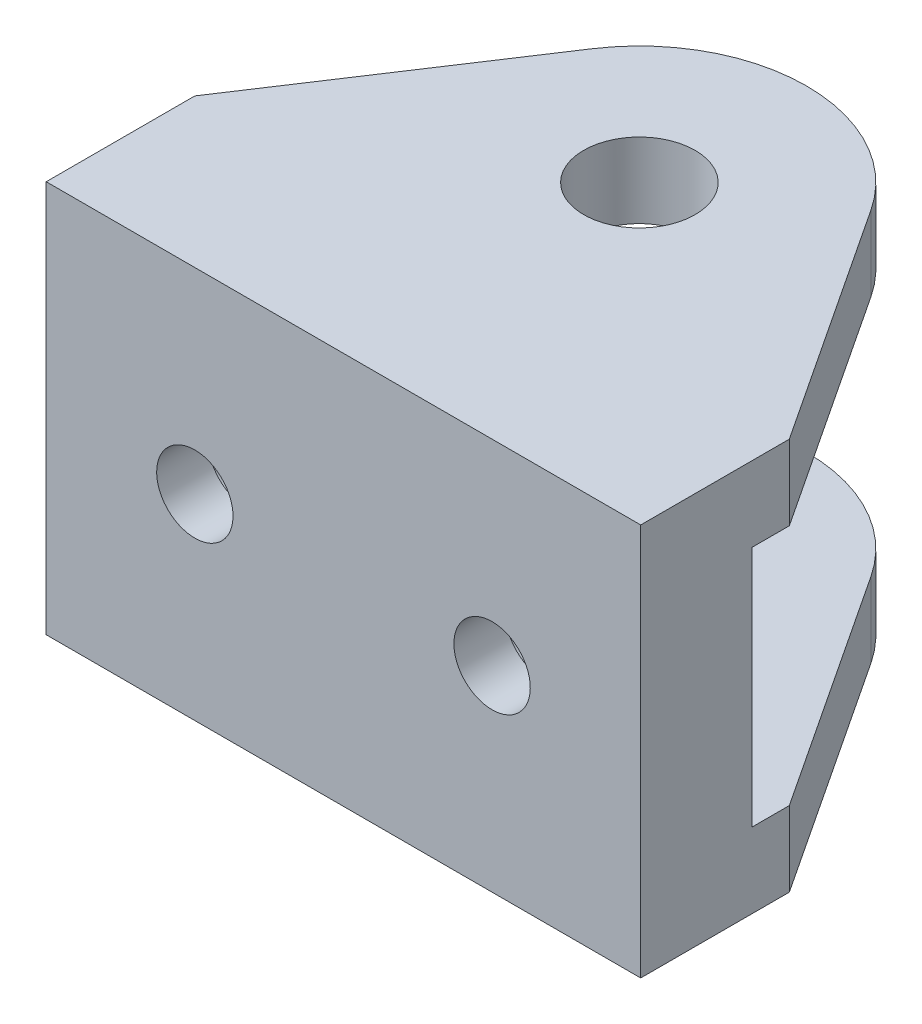
ISO-10303-21;
HEADER;
FILE_DESCRIPTION(('STEP AP214'),'2;1');
FILE_NAME('part.step','',(''),(''),'','','');
FILE_SCHEMA(('AUTOMOTIVE_DESIGN { 1 0 10303 214 1 1 1 1 }'));
ENDSEC;
DATA;
#1=APPLICATION_CONTEXT('core data for automotive mechanical design processes');
#2=APPLICATION_PROTOCOL_DEFINITION('international standard','automotive_design',2000,#1);
#3=PRODUCT_CONTEXT('',#1,'mechanical');
#4=PRODUCT('Part','Part','',(#3));
#5=PRODUCT_RELATED_PRODUCT_CATEGORY('part','',(#4));
#6=PRODUCT_DEFINITION_FORMATION('','',#4);
#7=PRODUCT_DEFINITION_CONTEXT('part definition',#1,'design');
#8=PRODUCT_DEFINITION('design','',#6,#7);
#9=PRODUCT_DEFINITION_SHAPE('','',#8);
#10=(LENGTH_UNIT() NAMED_UNIT(*) SI_UNIT(.MILLI.,.METRE.));
#11=(NAMED_UNIT(*) PLANE_ANGLE_UNIT() SI_UNIT($,.RADIAN.));
#12=(NAMED_UNIT(*) SI_UNIT($,.STERADIAN.) SOLID_ANGLE_UNIT());
#13=UNCERTAINTY_MEASURE_WITH_UNIT(LENGTH_MEASURE(1.E-05),#10,'distance_accuracy_value','');
#14=(GEOMETRIC_REPRESENTATION_CONTEXT(3) GLOBAL_UNCERTAINTY_ASSIGNED_CONTEXT((#13)) GLOBAL_UNIT_ASSIGNED_CONTEXT((#10,
#11,#12)) REPRESENTATION_CONTEXT('',''));
#15=CARTESIAN_POINT('',(0.,0.,0.));
#16=DIRECTION('',(0.,0.,1.));
#17=DIRECTION('',(1.,0.,0.));
#18=AXIS2_PLACEMENT_3D('',#15,#16,#17);
#19=CARTESIAN_POINT('',(12.7,16.764,9.23170329245909));
#20=DIRECTION('',(0.,0.,-1.));
#21=DIRECTION('',(0.,1.,0.));
#22=AXIS2_PLACEMENT_3D('',#19,#20,#21);
#23=CYLINDRICAL_SURFACE('',#22,3.2639);
#24=CARTESIAN_POINT('',(12.7,16.764,0.));
#25=DIRECTION('',(0.,0.,-1.));
#26=DIRECTION('',(-1.,0.,0.));
#27=AXIS2_PLACEMENT_3D('',#24,#25,#26);
#28=CIRCLE('',#27,3.2639);
#29=CARTESIAN_POINT('',(12.7,20.0279,0.));
#30=VERTEX_POINT('',#29);
#31=EDGE_CURVE('E309',#30,#30,#28,.F.);
#32=CARTESIAN_POINT('',(12.7,16.764,-4.4196));
#33=DIRECTION('',(0.,0.,-1.));
#34=DIRECTION('',(0.,1.,0.));
#35=AXIS2_PLACEMENT_3D('',#32,#33,#34);
#36=CIRCLE('',#35,3.2639);
#37=CARTESIAN_POINT('',(12.7,20.0279,-4.4196));
#38=VERTEX_POINT('',#37);
#39=EDGE_CURVE('E51',#38,#38,#36,.F.);
#40=CARTESIAN_POINT('',(12.7,20.0279,0.));
#41=CARTESIAN_POINT('',(12.7,20.0279,-0.0460375000000002));
#42=CARTESIAN_POINT('',(12.7,20.0279,-0.0920750000000005));
#43=CARTESIAN_POINT('',(12.7,20.0279,-0.18415));
#44=CARTESIAN_POINT('',(12.7,20.0279,-0.2301875));
#45=CARTESIAN_POINT('',(12.7,20.0279,-0.3222625));
#46=CARTESIAN_POINT('',(12.7,20.0279,-0.3683));
#47=CARTESIAN_POINT('',(12.7,20.0279,-0.460375));
#48=CARTESIAN_POINT('',(12.7,20.0279,-0.5064125));
#49=CARTESIAN_POINT('',(12.7,20.0279,-0.5984875));
#50=CARTESIAN_POINT('',(12.7,20.0279,-0.644525));
#51=CARTESIAN_POINT('',(12.7,20.0279,-0.7366));
#52=CARTESIAN_POINT('',(12.7,20.0279,-0.7826375));
#53=CARTESIAN_POINT('',(12.7,20.0279,-0.874712499999999));
#54=CARTESIAN_POINT('',(12.7,20.0279,-0.92075));
#55=CARTESIAN_POINT('',(12.7,20.0279,-1.012825));
#56=CARTESIAN_POINT('',(12.7,20.0279,-1.0588625));
#57=CARTESIAN_POINT('',(12.7,20.0279,-1.1509375));
#58=CARTESIAN_POINT('',(12.7,20.0279,-1.196975));
#59=CARTESIAN_POINT('',(12.7,20.0279,-1.28905));
#60=CARTESIAN_POINT('',(12.7,20.0279,-1.3350875));
#61=CARTESIAN_POINT('',(12.7,20.0279,-1.4271625));
#62=CARTESIAN_POINT('',(12.7,20.0279,-1.4732));
#63=CARTESIAN_POINT('',(12.7,20.0279,-1.565275));
#64=CARTESIAN_POINT('',(12.7,20.0279,-1.6113125));
#65=CARTESIAN_POINT('',(12.7,20.0279,-1.7033875));
#66=CARTESIAN_POINT('',(12.7,20.0279,-1.749425));
#67=CARTESIAN_POINT('',(12.7,20.0279,-1.8415));
#68=CARTESIAN_POINT('',(12.7,20.0279,-1.8875375));
#69=CARTESIAN_POINT('',(12.7,20.0279,-1.9796125));
#70=CARTESIAN_POINT('',(12.7,20.0279,-2.02565));
#71=CARTESIAN_POINT('',(12.7,20.0279,-2.117725));
#72=CARTESIAN_POINT('',(12.7,20.0279,-2.1637625));
#73=CARTESIAN_POINT('',(12.7,20.0279,-2.2558375));
#74=CARTESIAN_POINT('',(12.7,20.0279,-2.301875));
#75=CARTESIAN_POINT('',(12.7,20.0279,-2.39395));
#76=CARTESIAN_POINT('',(12.7,20.0279,-2.4399875));
#77=CARTESIAN_POINT('',(12.7,20.0279,-2.5320625));
#78=CARTESIAN_POINT('',(12.7,20.0279,-2.5781));
#79=CARTESIAN_POINT('',(12.7,20.0279,-2.670175));
#80=CARTESIAN_POINT('',(12.7,20.0279,-2.7162125));
#81=CARTESIAN_POINT('',(12.7,20.0279,-2.8082875));
#82=CARTESIAN_POINT('',(12.7,20.0279,-2.854325));
#83=CARTESIAN_POINT('',(12.7,20.0279,-2.9464));
#84=CARTESIAN_POINT('',(12.7,20.0279,-2.9924375));
#85=CARTESIAN_POINT('',(12.7,20.0279,-3.0845125));
#86=CARTESIAN_POINT('',(12.7,20.0279,-3.13055));
#87=CARTESIAN_POINT('',(12.7,20.0279,-3.222625));
#88=CARTESIAN_POINT('',(12.7,20.0279,-3.2686625));
#89=CARTESIAN_POINT('',(12.7,20.0279,-3.3607375));
#90=CARTESIAN_POINT('',(12.7,20.0279,-3.406775));
#91=CARTESIAN_POINT('',(12.7,20.0279,-3.49885));
#92=CARTESIAN_POINT('',(12.7,20.0279,-3.5448875));
#93=CARTESIAN_POINT('',(12.7,20.0279,-3.6369625));
#94=CARTESIAN_POINT('',(12.7,20.0279,-3.683));
#95=CARTESIAN_POINT('',(12.7,20.0279,-3.775075));
#96=CARTESIAN_POINT('',(12.7,20.0279,-3.8211125));
#97=CARTESIAN_POINT('',(12.7,20.0279,-3.9131875));
#98=CARTESIAN_POINT('',(12.7,20.0279,-3.959225));
#99=CARTESIAN_POINT('',(12.7,20.0279,-4.0513));
#100=CARTESIAN_POINT('',(12.7,20.0279,-4.0973375));
#101=CARTESIAN_POINT('',(12.7,20.0279,-4.1894125));
#102=CARTESIAN_POINT('',(12.7,20.0279,-4.23545));
#103=CARTESIAN_POINT('',(12.7,20.0279,-4.327525));
#104=CARTESIAN_POINT('',(12.7,20.0279,-4.3735625));
#105=CARTESIAN_POINT('',(12.7,20.0279,-4.4196));
#106=B_SPLINE_CURVE_WITH_KNOTS('',3,(#40,#41,#42,#43,#44,#45,#46,#47,#48,#49,#50,#51,#52,#53,
#54,#55,#56,#57,#58,#59,#60,#61,#62,#63,#64,#65,#66,#67,#68,#69,#70,#71,#72,#73,#74,#75,#76,#77,
#78,#79,#80,#81,#82,#83,#84,#85,#86,#87,#88,#89,#90,#91,#92,#93,#94,#95,#96,#97,#98,#99,#100,
#101,#102,#103,#104,#105),.UNSPECIFIED.,.F.,.F.,(4,2,2,2,2,2,2,2,2,2,2,2,2,2,2,2,2,2,2,2,2,2,2,
2,2,2,2,2,2,2,2,2,4),(0.,0.138112500000001,0.276225,0.4143375,0.552449999999999,0.6905625,
0.828674999999999,0.9667875,1.1049,1.2430125,1.381125,1.5192375,1.65735,1.7954625,1.933575,
2.0716875,2.2098,2.3479125,2.486025,2.6241375,2.76225,2.9003625,3.038475,3.1765875,3.3147,
3.4528125,3.590925,3.7290375,3.86715,4.0052625,4.143375,4.2814875,4.4196),.UNSPECIFIED.);
#107=EDGE_CURVE('BSEAM47',#30,#38,#106,.T.);
#108=ORIENTED_EDGE('',*,*,#31,.T.);
#109=ORIENTED_EDGE('',*,*,#39,.F.);
#110=ORIENTED_EDGE('',*,*,#107,.T.);
#111=ORIENTED_EDGE('',*,*,#107,.F.);
#112=EDGE_LOOP('',(#108,#110,#109,#111));
#113=FACE_BOUND('',#112,.T.);
#114=ADVANCED_FACE('F47',(#113),#23,.F.);
#115=CARTESIAN_POINT('',(38.1,16.764,9.23170329245909));
#116=DIRECTION('',(0.,0.,-1.));
#117=DIRECTION('',(0.,1.,0.));
#118=AXIS2_PLACEMENT_3D('',#115,#116,#117);
#119=CYLINDRICAL_SURFACE('',#118,3.2639);
#120=CARTESIAN_POINT('',(38.1,16.764,0.));
#121=DIRECTION('',(0.,0.,-1.));
#122=DIRECTION('',(-1.,0.,0.));
#123=AXIS2_PLACEMENT_3D('',#120,#121,#122);
#124=CIRCLE('',#123,3.2639);
#125=CARTESIAN_POINT('',(38.1,20.0279,0.));
#126=VERTEX_POINT('',#125);
#127=EDGE_CURVE('E190',#126,#126,#124,.F.);
#128=CARTESIAN_POINT('',(38.1,16.764,-4.4196));
#129=DIRECTION('',(0.,0.,-1.));
#130=DIRECTION('',(0.,1.,0.));
#131=AXIS2_PLACEMENT_3D('',#128,#129,#130);
#132=CIRCLE('',#131,3.2639);
#133=CARTESIAN_POINT('',(38.1,20.0279,-4.4196));
#134=VERTEX_POINT('',#133);
#135=EDGE_CURVE('E220',#134,#134,#132,.F.);
#136=CARTESIAN_POINT('',(38.1,20.0279,0.));
#137=CARTESIAN_POINT('',(38.1,20.0279,-0.0460375000000002));
#138=CARTESIAN_POINT('',(38.1,20.0279,-0.0920750000000005));
#139=CARTESIAN_POINT('',(38.1,20.0279,-0.18415));
#140=CARTESIAN_POINT('',(38.1,20.0279,-0.2301875));
#141=CARTESIAN_POINT('',(38.1,20.0279,-0.3222625));
#142=CARTESIAN_POINT('',(38.1,20.0279,-0.3683));
#143=CARTESIAN_POINT('',(38.1,20.0279,-0.460375));
#144=CARTESIAN_POINT('',(38.1,20.0279,-0.5064125));
#145=CARTESIAN_POINT('',(38.1,20.0279,-0.5984875));
#146=CARTESIAN_POINT('',(38.1,20.0279,-0.644525));
#147=CARTESIAN_POINT('',(38.1,20.0279,-0.7366));
#148=CARTESIAN_POINT('',(38.1,20.0279,-0.7826375));
#149=CARTESIAN_POINT('',(38.1,20.0279,-0.874712499999999));
#150=CARTESIAN_POINT('',(38.1,20.0279,-0.92075));
#151=CARTESIAN_POINT('',(38.1,20.0279,-1.012825));
#152=CARTESIAN_POINT('',(38.1,20.0279,-1.0588625));
#153=CARTESIAN_POINT('',(38.1,20.0279,-1.1509375));
#154=CARTESIAN_POINT('',(38.1,20.0279,-1.196975));
#155=CARTESIAN_POINT('',(38.1,20.0279,-1.28905));
#156=CARTESIAN_POINT('',(38.1,20.0279,-1.3350875));
#157=CARTESIAN_POINT('',(38.1,20.0279,-1.4271625));
#158=CARTESIAN_POINT('',(38.1,20.0279,-1.4732));
#159=CARTESIAN_POINT('',(38.1,20.0279,-1.565275));
#160=CARTESIAN_POINT('',(38.1,20.0279,-1.6113125));
#161=CARTESIAN_POINT('',(38.1,20.0279,-1.7033875));
#162=CARTESIAN_POINT('',(38.1,20.0279,-1.749425));
#163=CARTESIAN_POINT('',(38.1,20.0279,-1.8415));
#164=CARTESIAN_POINT('',(38.1,20.0279,-1.8875375));
#165=CARTESIAN_POINT('',(38.1,20.0279,-1.9796125));
#166=CARTESIAN_POINT('',(38.1,20.0279,-2.02565));
#167=CARTESIAN_POINT('',(38.1,20.0279,-2.117725));
#168=CARTESIAN_POINT('',(38.1,20.0279,-2.1637625));
#169=CARTESIAN_POINT('',(38.1,20.0279,-2.2558375));
#170=CARTESIAN_POINT('',(38.1,20.0279,-2.301875));
#171=CARTESIAN_POINT('',(38.1,20.0279,-2.39395));
#172=CARTESIAN_POINT('',(38.1,20.0279,-2.4399875));
#173=CARTESIAN_POINT('',(38.1,20.0279,-2.5320625));
#174=CARTESIAN_POINT('',(38.1,20.0279,-2.5781));
#175=CARTESIAN_POINT('',(38.1,20.0279,-2.670175));
#176=CARTESIAN_POINT('',(38.1,20.0279,-2.7162125));
#177=CARTESIAN_POINT('',(38.1,20.0279,-2.8082875));
#178=CARTESIAN_POINT('',(38.1,20.0279,-2.854325));
#179=CARTESIAN_POINT('',(38.1,20.0279,-2.9464));
#180=CARTESIAN_POINT('',(38.1,20.0279,-2.9924375));
#181=CARTESIAN_POINT('',(38.1,20.0279,-3.0845125));
#182=CARTESIAN_POINT('',(38.1,20.0279,-3.13055));
#183=CARTESIAN_POINT('',(38.1,20.0279,-3.222625));
#184=CARTESIAN_POINT('',(38.1,20.0279,-3.2686625));
#185=CARTESIAN_POINT('',(38.1,20.0279,-3.3607375));
#186=CARTESIAN_POINT('',(38.1,20.0279,-3.406775));
#187=CARTESIAN_POINT('',(38.1,20.0279,-3.49885));
#188=CARTESIAN_POINT('',(38.1,20.0279,-3.5448875));
#189=CARTESIAN_POINT('',(38.1,20.0279,-3.6369625));
#190=CARTESIAN_POINT('',(38.1,20.0279,-3.683));
#191=CARTESIAN_POINT('',(38.1,20.0279,-3.775075));
#192=CARTESIAN_POINT('',(38.1,20.0279,-3.8211125));
#193=CARTESIAN_POINT('',(38.1,20.0279,-3.9131875));
#194=CARTESIAN_POINT('',(38.1,20.0279,-3.959225));
#195=CARTESIAN_POINT('',(38.1,20.0279,-4.0513));
#196=CARTESIAN_POINT('',(38.1,20.0279,-4.0973375));
#197=CARTESIAN_POINT('',(38.1,20.0279,-4.1894125));
#198=CARTESIAN_POINT('',(38.1,20.0279,-4.23545));
#199=CARTESIAN_POINT('',(38.1,20.0279,-4.327525));
#200=CARTESIAN_POINT('',(38.1,20.0279,-4.3735625));
#201=CARTESIAN_POINT('',(38.1,20.0279,-4.4196));
#202=B_SPLINE_CURVE_WITH_KNOTS('',3,(#136,#137,#138,#139,#140,#141,#142,#143,#144,#145,#146,
#147,#148,#149,#150,#151,#152,#153,#154,#155,#156,#157,#158,#159,#160,#161,#162,#163,#164,#165,
#166,#167,#168,#169,#170,#171,#172,#173,#174,#175,#176,#177,#178,#179,#180,#181,#182,#183,#184,
#185,#186,#187,#188,#189,#190,#191,#192,#193,#194,#195,#196,#197,#198,#199,#200,#201),
.UNSPECIFIED.,.F.,.F.,(4,2,2,2,2,2,2,2,2,2,2,2,2,2,2,2,2,2,2,2,2,2,2,2,2,2,2,2,2,2,2,2,4),(0.,
0.138112500000001,0.276225,0.4143375,0.552449999999999,0.6905625,0.828674999999999,0.9667875,
1.1049,1.2430125,1.381125,1.5192375,1.65735,1.7954625,1.933575,2.0716875,2.2098,2.3479125,
2.486025,2.6241375,2.76225,2.9003625,3.038475,3.1765875,3.3147,3.4528125,3.590925,3.7290375,
3.86715,4.0052625,4.143375,4.2814875,4.4196),.UNSPECIFIED.);
#203=EDGE_CURVE('BSEAM320',#126,#134,#202,.T.);
#204=ORIENTED_EDGE('',*,*,#127,.T.);
#205=ORIENTED_EDGE('',*,*,#135,.F.);
#206=ORIENTED_EDGE('',*,*,#203,.T.);
#207=ORIENTED_EDGE('',*,*,#203,.F.);
#208=EDGE_LOOP('',(#204,#206,#205,#207));
#209=FACE_BOUND('',#208,.T.);
#210=ADVANCED_FACE('F320',(#209),#119,.F.);
#211=CARTESIAN_POINT('',(50.8,0.,0.));
#212=DIRECTION('',(0.,0.,-1.));
#213=DIRECTION('',(-1.,0.,0.));
#214=AXIS2_PLACEMENT_3D('',#211,#212,#213);
#215=PLANE('',#214);
#216=ORIENTED_EDGE('',*,*,#127,.F.);
#217=EDGE_LOOP('',(#216));
#218=FACE_BOUND('',#217,.T.);
#219=ORIENTED_EDGE('',*,*,#31,.F.);
#220=EDGE_LOOP('',(#219));
#221=FACE_BOUND('',#220,.T.);
#222=DIRECTION('',(0.,-1.,0.));
#223=VECTOR('',#222,1.);
#224=CARTESIAN_POINT('',(0.,0.,0.));
#225=LINE('',#224,#223);
#226=CARTESIAN_POINT('',(0.,33.528,0.));
#227=VERTEX_POINT('',#226);
#228=CARTESIAN_POINT('',(0.,0.,0.));
#229=VERTEX_POINT('',#228);
#230=EDGE_CURVE('E185',#227,#229,#225,.T.);
#231=ORIENTED_EDGE('',*,*,#230,.T.);
#232=DIRECTION('',(-1.,0.,0.));
#233=VECTOR('',#232,1.);
#234=CARTESIAN_POINT('',(50.8,0.,0.));
#235=LINE('',#234,#233);
#236=CARTESIAN_POINT('',(50.8,0.,0.));
#237=VERTEX_POINT('',#236);
#238=EDGE_CURVE('E216',#237,#229,#235,.T.);
#239=ORIENTED_EDGE('',*,*,#238,.F.);
#240=DIRECTION('',(0.,-1.,0.));
#241=VECTOR('',#240,1.);
#242=CARTESIAN_POINT('',(50.8,0.,0.));
#243=LINE('',#242,#241);
#244=CARTESIAN_POINT('',(50.8,33.528,0.));
#245=VERTEX_POINT('',#244);
#246=EDGE_CURVE('E162',#245,#237,#243,.T.);
#247=ORIENTED_EDGE('',*,*,#246,.F.);
#248=DIRECTION('',(-1.,0.,0.));
#249=VECTOR('',#248,1.);
#250=CARTESIAN_POINT('',(50.8,33.528,0.));
#251=LINE('',#250,#249);
#252=EDGE_CURVE('E184',#245,#227,#251,.T.);
#253=ORIENTED_EDGE('',*,*,#252,.T.);
#254=EDGE_LOOP('',(#231,#239,#247,#253));
#255=FACE_BOUND('',#254,.T.);
#256=ADVANCED_FACE('F49',(#218,#221,#255),#215,.F.);
#257=CARTESIAN_POINT('',(50.8,0.,0.));
#258=DIRECTION('',(0.,1.,0.));
#259=DIRECTION('',(0.,0.,1.));
#260=AXIS2_PLACEMENT_3D('',#257,#258,#259);
#261=PLANE('',#260);
#262=CARTESIAN_POINT('',(25.4,0.,-25.286907358924));
#263=DIRECTION('',(0.,-1.,0.));
#264=DIRECTION('',(0.,0.,-1.));
#265=AXIS2_PLACEMENT_3D('',#262,#263,#264);
#266=CIRCLE('',#265,4.7625);
#267=CARTESIAN_POINT('',(25.4,0.,-30.049407358924));
#268=VERTEX_POINT('',#267);
#269=EDGE_CURVE('E158',#268,#268,#266,.T.);
#270=ORIENTED_EDGE('',*,*,#269,.F.);
#271=EDGE_LOOP('',(#270));
#272=FACE_BOUND('',#271,.T.);
#273=DIRECTION('',(0.,0.,-1.));
#274=VECTOR('',#273,1.);
#275=CARTESIAN_POINT('',(0.,0.,0.));
#276=LINE('',#275,#274);
#277=CARTESIAN_POINT('',(0.,0.,-12.7));
#278=VERTEX_POINT('',#277);
#279=EDGE_CURVE('E189',#229,#278,#276,.T.);
#280=ORIENTED_EDGE('',*,*,#279,.T.);
#281=DIRECTION('',(-0.550098347190821,0.,0.835099879306617));
#282=VECTOR('',#281,1.);
#283=CARTESIAN_POINT('',(0.,0.,-12.7));
#284=LINE('',#283,#282);
#285=CARTESIAN_POINT('',(13.4685104744067,0.,-33.1464374944129));
#286=VERTEX_POINT('',#285);
#287=EDGE_CURVE('E65',#286,#278,#284,.T.);
#288=ORIENTED_EDGE('',*,*,#287,.F.);
#289=CARTESIAN_POINT('',(25.4,0.,-25.286907358924));
#290=DIRECTION('',(0.,1.,0.));
#291=DIRECTION('',(0.,0.,-1.));
#292=AXIS2_PLACEMENT_3D('',#289,#290,#291);
#293=CIRCLE('',#292,14.2875);
#294=CARTESIAN_POINT('',(37.3314895255933,0.,-33.1464374944129));
#295=VERTEX_POINT('',#294);
#296=EDGE_CURVE('E156',#295,#286,#293,.T.);
#297=ORIENTED_EDGE('',*,*,#296,.F.);
#298=DIRECTION('',(-0.550098347190821,0.,-0.835099879306617));
#299=VECTOR('',#298,1.);
#300=CARTESIAN_POINT('',(37.3314895255933,0.,-33.1464374944129));
#301=LINE('',#300,#299);
#302=CARTESIAN_POINT('',(50.8,0.,-12.7));
#303=VERTEX_POINT('',#302);
#304=EDGE_CURVE('E142',#303,#295,#301,.T.);
#305=ORIENTED_EDGE('',*,*,#304,.F.);
#306=DIRECTION('',(0.,0.,-1.));
#307=VECTOR('',#306,1.);
#308=CARTESIAN_POINT('',(50.8,0.,0.));
#309=LINE('',#308,#307);
#310=EDGE_CURVE('E153',#237,#303,#309,.T.);
#311=ORIENTED_EDGE('',*,*,#310,.F.);
#312=ORIENTED_EDGE('',*,*,#238,.T.);
#313=EDGE_LOOP('',(#280,#288,#297,#305,#311,#312));
#314=FACE_BOUND('',#313,.T.);
#315=ADVANCED_FACE('F151',(#272,#314),#261,.F.);
#316=CARTESIAN_POINT('',(50.8,6.4135,-9.4996));
#317=DIRECTION('',(0.,-1.,0.));
#318=DIRECTION('',(0.,0.,-1.));
#319=AXIS2_PLACEMENT_3D('',#316,#317,#318);
#320=PLANE('',#319);
#321=CARTESIAN_POINT('',(25.4,6.4135,-25.286907358924));
#322=DIRECTION('',(0.,-1.,0.));
#323=DIRECTION('',(0.,0.,-1.));
#324=AXIS2_PLACEMENT_3D('',#321,#322,#323);
#325=CIRCLE('',#324,4.7625);
#326=CARTESIAN_POINT('',(25.4,6.4135,-30.049407358924));
#327=VERTEX_POINT('',#326);
#328=EDGE_CURVE('E305',#327,#327,#325,.T.);
#329=ORIENTED_EDGE('',*,*,#328,.T.);
#330=EDGE_LOOP('',(#329));
#331=FACE_BOUND('',#330,.T.);
#332=CARTESIAN_POINT('',(25.4,6.4135,-25.286907358924));
#333=DIRECTION('',(0.,-1.,0.));
#334=DIRECTION('',(0.,0.,-1.));
#335=AXIS2_PLACEMENT_3D('',#332,#333,#334);
#336=CIRCLE('',#335,14.2875);
#337=CARTESIAN_POINT('',(37.3314895255933,6.4135,-33.1464374944129));
#338=VERTEX_POINT('',#337);
#339=CARTESIAN_POINT('',(13.4685104744067,6.4135,-33.1464374944129));
#340=VERTEX_POINT('',#339);
#341=EDGE_CURVE('E297',#338,#340,#336,.F.);
#342=ORIENTED_EDGE('',*,*,#341,.T.);
#343=DIRECTION('',(-0.550098347190821,0.,0.835099879306617));
#344=VECTOR('',#343,1.);
#345=CARTESIAN_POINT('',(13.9022737748374,6.4135,-33.8049300743072));
#346=LINE('',#345,#344);
#347=CARTESIAN_POINT('',(0.,6.4135,-12.7));
#348=VERTEX_POINT('',#347);
#349=EDGE_CURVE('E283',#340,#348,#346,.T.);
#350=ORIENTED_EDGE('',*,*,#349,.T.);
#351=DIRECTION('',(0.,0.,1.));
#352=VECTOR('',#351,1.);
#353=CARTESIAN_POINT('',(0.,6.4135,-9.4996));
#354=LINE('',#353,#352);
#355=CARTESIAN_POINT('',(0.,6.4135,-9.4996));
#356=VERTEX_POINT('',#355);
#357=EDGE_CURVE('E193',#348,#356,#354,.T.);
#358=ORIENTED_EDGE('',*,*,#357,.T.);
#359=DIRECTION('',(-1.,0.,0.));
#360=VECTOR('',#359,1.);
#361=CARTESIAN_POINT('',(50.8,6.4135,-9.4996));
#362=LINE('',#361,#360);
#363=CARTESIAN_POINT('',(50.8,6.4135,-9.4996));
#364=VERTEX_POINT('',#363);
#365=EDGE_CURVE('E212',#364,#356,#362,.T.);
#366=ORIENTED_EDGE('',*,*,#365,.F.);
#367=DIRECTION('',(0.,0.,1.));
#368=VECTOR('',#367,1.);
#369=CARTESIAN_POINT('',(50.8,6.4135,-9.4996));
#370=LINE('',#369,#368);
#371=CARTESIAN_POINT('',(50.8,6.4135,-12.7));
#372=VERTEX_POINT('',#371);
#373=EDGE_CURVE('E165',#372,#364,#370,.T.);
#374=ORIENTED_EDGE('',*,*,#373,.F.);
#375=DIRECTION('',(-0.550098347190821,0.,-0.835099879306617));
#376=VECTOR('',#375,1.);
#377=CARTESIAN_POINT('',(52.270222357532,6.4135,-10.4680672563393));
#378=LINE('',#377,#376);
#379=EDGE_CURVE('E145',#372,#338,#378,.T.);
#380=ORIENTED_EDGE('',*,*,#379,.T.);
#381=EDGE_LOOP('',(#342,#350,#358,#366,#374,#380));
#382=FACE_BOUND('',#381,.T.);
#383=ADVANCED_FACE('F332',(#331,#382),#320,.F.);
#384=CARTESIAN_POINT('',(50.8,27.1145,-9.4996));
#385=DIRECTION('',(0.,0.,1.));
#386=DIRECTION('',(0.,-1.,0.));
#387=AXIS2_PLACEMENT_3D('',#384,#385,#386);
#388=PLANE('',#387);
#389=CARTESIAN_POINT('',(12.7,16.764,-9.4996));
#390=DIRECTION('',(0.,0.,-1.));
#391=DIRECTION('',(0.,1.,0.));
#392=AXIS2_PLACEMENT_3D('',#389,#390,#391);
#393=CIRCLE('',#392,4.7625);
#394=CARTESIAN_POINT('',(12.7,21.5265,-9.4996));
#395=VERTEX_POINT('',#394);
#396=EDGE_CURVE('E231',#395,#395,#393,.T.);
#397=ORIENTED_EDGE('',*,*,#396,.F.);
#398=EDGE_LOOP('',(#397));
#399=FACE_BOUND('',#398,.T.);
#400=CARTESIAN_POINT('',(38.1,16.764,-9.4996));
#401=DIRECTION('',(0.,0.,-1.));
#402=DIRECTION('',(0.,1.,0.));
#403=AXIS2_PLACEMENT_3D('',#400,#401,#402);
#404=CIRCLE('',#403,4.7625);
#405=CARTESIAN_POINT('',(38.1,21.5265,-9.4996));
#406=VERTEX_POINT('',#405);
#407=EDGE_CURVE('E237',#406,#406,#404,.T.);
#408=ORIENTED_EDGE('',*,*,#407,.F.);
#409=EDGE_LOOP('',(#408));
#410=FACE_BOUND('',#409,.T.);
#411=DIRECTION('',(0.,1.,0.));
#412=VECTOR('',#411,1.);
#413=CARTESIAN_POINT('',(0.,27.1145,-9.4996));
#414=LINE('',#413,#412);
#415=CARTESIAN_POINT('',(0.,27.1145,-9.4996));
#416=VERTEX_POINT('',#415);
#417=EDGE_CURVE('E196',#356,#416,#414,.T.);
#418=ORIENTED_EDGE('',*,*,#417,.T.);
#419=DIRECTION('',(-1.,0.,0.));
#420=VECTOR('',#419,1.);
#421=CARTESIAN_POINT('',(50.8,27.1145,-9.4996));
#422=LINE('',#421,#420);
#423=CARTESIAN_POINT('',(50.8,27.1145,-9.4996));
#424=VERTEX_POINT('',#423);
#425=EDGE_CURVE('E208',#424,#416,#422,.T.);
#426=ORIENTED_EDGE('',*,*,#425,.F.);
#427=DIRECTION('',(0.,1.,0.));
#428=VECTOR('',#427,1.);
#429=CARTESIAN_POINT('',(50.8,27.1145,-9.4996));
#430=LINE('',#429,#428);
#431=EDGE_CURVE('E169',#364,#424,#430,.T.);
#432=ORIENTED_EDGE('',*,*,#431,.F.);
#433=ORIENTED_EDGE('',*,*,#365,.T.);
#434=EDGE_LOOP('',(#418,#426,#432,#433));
#435=FACE_BOUND('',#434,.T.);
#436=ADVANCED_FACE('F370',(#399,#410,#435),#388,.F.);
#437=CARTESIAN_POINT('',(50.8,27.1145,-41.796907358924));
#438=DIRECTION('',(0.,1.,0.));
#439=DIRECTION('',(0.,0.,1.));
#440=AXIS2_PLACEMENT_3D('',#437,#438,#439);
#441=PLANE('',#440);
#442=CARTESIAN_POINT('',(25.4,27.1145,-25.286907358924));
#443=DIRECTION('',(0.,1.,0.));
#444=DIRECTION('',(0.,0.,1.));
#445=AXIS2_PLACEMENT_3D('',#442,#443,#444);
#446=CIRCLE('',#445,4.7625);
#447=CARTESIAN_POINT('',(25.4,27.1145,-20.524407358924));
#448=VERTEX_POINT('',#447);
#449=EDGE_CURVE('E301',#448,#448,#446,.T.);
#450=ORIENTED_EDGE('',*,*,#449,.T.);
#451=EDGE_LOOP('',(#450));
#452=FACE_BOUND('',#451,.T.);
#453=DIRECTION('',(0.,0.,-1.));
#454=VECTOR('',#453,1.);
#455=CARTESIAN_POINT('',(0.,27.1145,-41.796907358924));
#456=LINE('',#455,#454);
#457=CARTESIAN_POINT('',(0.,27.1145,-12.7));
#458=VERTEX_POINT('',#457);
#459=EDGE_CURVE('E199',#416,#458,#456,.T.);
#460=ORIENTED_EDGE('',*,*,#459,.T.);
#461=DIRECTION('',(0.550098347190821,0.,-0.835099879306617));
#462=VECTOR('',#461,1.);
#463=CARTESIAN_POINT('',(28.7392389564309,27.1145,-56.3288076603768));
#464=LINE('',#463,#462);
#465=CARTESIAN_POINT('',(13.4685104744067,27.1145,-33.1464374944129));
#466=VERTEX_POINT('',#465);
#467=EDGE_CURVE('E73',#458,#466,#464,.T.);
#468=ORIENTED_EDGE('',*,*,#467,.T.);
#469=CARTESIAN_POINT('',(25.4,27.1145,-25.286907358924));
#470=DIRECTION('',(0.,1.,0.));
#471=DIRECTION('',(0.,0.,1.));
#472=AXIS2_PLACEMENT_3D('',#469,#470,#471);
#473=CIRCLE('',#472,14.2875);
#474=CARTESIAN_POINT('',(37.3314895255933,27.1145,-33.1464374944129));
#475=VERTEX_POINT('',#474);
#476=EDGE_CURVE('E293',#466,#475,#473,.F.);
#477=ORIENTED_EDGE('',*,*,#476,.T.);
#478=DIRECTION('',(0.550098347190821,0.,0.835099879306617));
#479=VECTOR('',#478,1.);
#480=CARTESIAN_POINT('',(37.4332571759384,27.1145,-32.9919448424089));
#481=LINE('',#480,#479);
#482=CARTESIAN_POINT('',(50.8,27.1145,-12.7));
#483=VERTEX_POINT('',#482);
#484=EDGE_CURVE('E287',#475,#483,#481,.T.);
#485=ORIENTED_EDGE('',*,*,#484,.T.);
#486=DIRECTION('',(0.,0.,-1.));
#487=VECTOR('',#486,1.);
#488=CARTESIAN_POINT('',(50.8,27.1145,-41.796907358924));
#489=LINE('',#488,#487);
#490=EDGE_CURVE('E177',#424,#483,#489,.T.);
#491=ORIENTED_EDGE('',*,*,#490,.F.);
#492=ORIENTED_EDGE('',*,*,#425,.T.);
#493=EDGE_LOOP('',(#460,#468,#477,#485,#491,#492));
#494=FACE_BOUND('',#493,.T.);
#495=ADVANCED_FACE('F366',(#452,#494),#441,.F.);
#496=CARTESIAN_POINT('',(50.8,33.528,0.));
#497=DIRECTION('',(0.,-1.,0.));
#498=DIRECTION('',(0.,0.,-1.));
#499=AXIS2_PLACEMENT_3D('',#496,#497,#498);
#500=PLANE('',#499);
#501=CARTESIAN_POINT('',(25.4,33.528,-25.286907358924));
#502=DIRECTION('',(0.,-1.,0.));
#503=DIRECTION('',(0.,0.,-1.));
#504=AXIS2_PLACEMENT_3D('',#501,#502,#503);
#505=CIRCLE('',#504,4.7625);
#506=CARTESIAN_POINT('',(25.4,33.528,-30.049407358924));
#507=VERTEX_POINT('',#506);
#508=EDGE_CURVE('E229',#507,#507,#505,.F.);
#509=ORIENTED_EDGE('',*,*,#508,.F.);
#510=EDGE_LOOP('',(#509));
#511=FACE_BOUND('',#510,.T.);
#512=CARTESIAN_POINT('',(25.4,33.528,-25.286907358924));
#513=DIRECTION('',(0.,-1.,0.));
#514=DIRECTION('',(0.,0.,-1.));
#515=AXIS2_PLACEMENT_3D('',#512,#513,#514);
#516=CIRCLE('',#515,14.2875);
#517=CARTESIAN_POINT('',(13.4685104744067,33.528,-33.1464374944129));
#518=VERTEX_POINT('',#517);
#519=CARTESIAN_POINT('',(37.3314895255933,33.528,-33.1464374944129));
#520=VERTEX_POINT('',#519);
#521=EDGE_CURVE('E256',#518,#520,#516,.T.);
#522=ORIENTED_EDGE('',*,*,#521,.F.);
#523=DIRECTION('',(0.550098347190821,0.,-0.835099879306617));
#524=VECTOR('',#523,1.);
#525=CARTESIAN_POINT('',(0.,33.528,-12.7));
#526=LINE('',#525,#524);
#527=CARTESIAN_POINT('',(0.,33.528,-12.7));
#528=VERTEX_POINT('',#527);
#529=EDGE_CURVE('E260',#528,#518,#526,.T.);
#530=ORIENTED_EDGE('',*,*,#529,.F.);
#531=DIRECTION('',(0.,0.,1.));
#532=VECTOR('',#531,1.);
#533=CARTESIAN_POINT('',(0.,33.528,0.));
#534=LINE('',#533,#532);
#535=EDGE_CURVE('E171',#528,#227,#534,.T.);
#536=ORIENTED_EDGE('',*,*,#535,.T.);
#537=ORIENTED_EDGE('',*,*,#252,.F.);
#538=DIRECTION('',(0.,0.,1.));
#539=VECTOR('',#538,1.);
#540=CARTESIAN_POINT('',(50.8,33.528,0.));
#541=LINE('',#540,#539);
#542=CARTESIAN_POINT('',(50.8,33.528,-12.7));
#543=VERTEX_POINT('',#542);
#544=EDGE_CURVE('E181',#543,#245,#541,.T.);
#545=ORIENTED_EDGE('',*,*,#544,.F.);
#546=DIRECTION('',(0.550098347190821,0.,0.835099879306617));
#547=VECTOR('',#546,1.);
#548=CARTESIAN_POINT('',(37.3314895255933,33.528,-33.1464374944129));
#549=LINE('',#548,#547);
#550=EDGE_CURVE('E253',#520,#543,#549,.T.);
#551=ORIENTED_EDGE('',*,*,#550,.F.);
#552=EDGE_LOOP('',(#522,#530,#536,#537,#545,#551));
#553=FACE_BOUND('',#552,.T.);
#554=ADVANCED_FACE('F361',(#511,#553),#500,.F.);
#555=CARTESIAN_POINT('',(50.8,0.,0.));
#556=DIRECTION('',(-1.,0.,0.));
#557=DIRECTION('',(0.,0.,1.));
#558=AXIS2_PLACEMENT_3D('',#555,#556,#557);
#559=PLANE('',#558);
#560=ORIENTED_EDGE('',*,*,#310,.T.);
#561=DIRECTION('',(0.,1.,0.));
#562=VECTOR('',#561,1.);
#563=CARTESIAN_POINT('',(50.8,0.,-12.7));
#564=LINE('',#563,#562);
#565=EDGE_CURVE('E11',#303,#372,#564,.T.);
#566=ORIENTED_EDGE('',*,*,#565,.T.);
#567=ORIENTED_EDGE('',*,*,#373,.T.);
#568=ORIENTED_EDGE('',*,*,#431,.T.);
#569=ORIENTED_EDGE('',*,*,#490,.T.);
#570=DIRECTION('',(0.,-1.,0.));
#571=VECTOR('',#570,1.);
#572=CARTESIAN_POINT('',(50.8,92.0708904125326,-12.7));
#573=LINE('',#572,#571);
#574=EDGE_CURVE('E267',#543,#483,#573,.T.);
#575=ORIENTED_EDGE('',*,*,#574,.F.);
#576=ORIENTED_EDGE('',*,*,#544,.T.);
#577=ORIENTED_EDGE('',*,*,#246,.T.);
#578=EDGE_LOOP('',(#560,#566,#567,#568,#569,#575,#576,#577));
#579=FACE_BOUND('',#578,.T.);
#580=ADVANCED_FACE('F160',(#579),#559,.F.);
#581=CARTESIAN_POINT('',(0.,0.,0.));
#582=DIRECTION('',(-1.,0.,0.));
#583=DIRECTION('',(0.,0.,1.));
#584=AXIS2_PLACEMENT_3D('',#581,#582,#583);
#585=PLANE('',#584);
#586=DIRECTION('',(0.,1.,0.));
#587=VECTOR('',#586,1.);
#588=CARTESIAN_POINT('',(0.,0.,-12.7));
#589=LINE('',#588,#587);
#590=EDGE_CURVE('E57',#278,#348,#589,.T.);
#591=ORIENTED_EDGE('',*,*,#590,.F.);
#592=ORIENTED_EDGE('',*,*,#279,.F.);
#593=ORIENTED_EDGE('',*,*,#230,.F.);
#594=ORIENTED_EDGE('',*,*,#535,.F.);
#595=DIRECTION('',(0.,-1.,0.));
#596=VECTOR('',#595,1.);
#597=CARTESIAN_POINT('',(0.,92.0708904125326,-12.7));
#598=LINE('',#597,#596);
#599=EDGE_CURVE('E257',#528,#458,#598,.T.);
#600=ORIENTED_EDGE('',*,*,#599,.T.);
#601=ORIENTED_EDGE('',*,*,#459,.F.);
#602=ORIENTED_EDGE('',*,*,#417,.F.);
#603=ORIENTED_EDGE('',*,*,#357,.F.);
#604=EDGE_LOOP('',(#591,#592,#593,#594,#600,#601,#602,#603));
#605=FACE_BOUND('',#604,.T.);
#606=ADVANCED_FACE('F326',(#605),#585,.T.);
#607=CARTESIAN_POINT('',(37.3314895255933,92.0708904125326,-33.1464374944129));
#608=DIRECTION('',(-0.835099879306617,0.,0.550098347190821));
#609=DIRECTION('',(0.550098347190821,0.,0.835099879306617));
#610=AXIS2_PLACEMENT_3D('',#607,#608,#609);
#611=PLANE('',#610);
#612=DIRECTION('',(0.,-1.,0.));
#613=VECTOR('',#612,1.);
#614=CARTESIAN_POINT('',(37.3314895255933,92.0708904125326,-33.1464374944129));
#615=LINE('',#614,#613);
#616=EDGE_CURVE('E274',#520,#475,#615,.T.);
#617=ORIENTED_EDGE('',*,*,#616,.F.);
#618=ORIENTED_EDGE('',*,*,#550,.T.);
#619=ORIENTED_EDGE('',*,*,#574,.T.);
#620=ORIENTED_EDGE('',*,*,#484,.F.);
#621=EDGE_LOOP('',(#617,#618,#619,#620));
#622=FACE_BOUND('',#621,.T.);
#623=ADVANCED_FACE('F346',(#622),#611,.F.);
#624=CARTESIAN_POINT('',(0.,92.0708904125326,-12.7));
#625=DIRECTION('',(0.835099879306617,0.,0.550098347190821));
#626=DIRECTION('',(0.550098347190821,0.,-0.835099879306617));
#627=AXIS2_PLACEMENT_3D('',#624,#625,#626);
#628=PLANE('',#627);
#629=ORIENTED_EDGE('',*,*,#599,.F.);
#630=ORIENTED_EDGE('',*,*,#529,.T.);
#631=DIRECTION('',(0.,-1.,0.));
#632=VECTOR('',#631,1.);
#633=CARTESIAN_POINT('',(13.4685104744067,92.0708904125326,-33.1464374944129));
#634=LINE('',#633,#632);
#635=EDGE_CURVE('E270',#518,#466,#634,.T.);
#636=ORIENTED_EDGE('',*,*,#635,.T.);
#637=ORIENTED_EDGE('',*,*,#467,.F.);
#638=EDGE_LOOP('',(#629,#630,#636,#637));
#639=FACE_BOUND('',#638,.T.);
#640=ADVANCED_FACE('F347',(#639),#628,.F.);
#641=CARTESIAN_POINT('',(25.4,92.0708904125326,-25.286907358924));
#642=DIRECTION('',(0.,-1.,0.));
#643=DIRECTION('',(0.,0.,-1.));
#644=AXIS2_PLACEMENT_3D('',#641,#642,#643);
#645=CYLINDRICAL_SURFACE('',#644,14.2875);
#646=ORIENTED_EDGE('',*,*,#635,.F.);
#647=ORIENTED_EDGE('',*,*,#521,.T.);
#648=ORIENTED_EDGE('',*,*,#616,.T.);
#649=ORIENTED_EDGE('',*,*,#476,.F.);
#650=EDGE_LOOP('',(#646,#647,#648,#649));
#651=FACE_BOUND('',#650,.T.);
#652=ADVANCED_FACE('F339',(#651),#645,.T.);
#653=EDGE_CURVE('E278',#338,#295,#615,.T.);
#654=ORIENTED_EDGE('',*,*,#653,.T.);
#655=ORIENTED_EDGE('',*,*,#296,.T.);
#656=EDGE_CURVE('E273',#340,#286,#634,.T.);
#657=ORIENTED_EDGE('',*,*,#656,.F.);
#658=ORIENTED_EDGE('',*,*,#341,.F.);
#659=EDGE_LOOP('',(#654,#655,#657,#658));
#660=FACE_BOUND('',#659,.T.);
#661=ADVANCED_FACE('F335',(#660),#645,.T.);
#662=ORIENTED_EDGE('',*,*,#565,.F.);
#663=ORIENTED_EDGE('',*,*,#304,.T.);
#664=ORIENTED_EDGE('',*,*,#653,.F.);
#665=ORIENTED_EDGE('',*,*,#379,.F.);
#666=EDGE_LOOP('',(#662,#663,#664,#665));
#667=FACE_BOUND('',#666,.T.);
#668=ADVANCED_FACE('F140',(#667),#611,.F.);
#669=ORIENTED_EDGE('',*,*,#656,.T.);
#670=ORIENTED_EDGE('',*,*,#287,.T.);
#671=ORIENTED_EDGE('',*,*,#590,.T.);
#672=ORIENTED_EDGE('',*,*,#349,.F.);
#673=EDGE_LOOP('',(#669,#670,#671,#672));
#674=FACE_BOUND('',#673,.T.);
#675=ADVANCED_FACE('F329',(#674),#628,.F.);
#676=CARTESIAN_POINT('',(25.4,92.0708904125326,-25.286907358924));
#677=DIRECTION('',(0.,-1.,0.));
#678=DIRECTION('',(0.,0.,-1.));
#679=AXIS2_PLACEMENT_3D('',#676,#677,#678);
#680=CYLINDRICAL_SURFACE('',#679,4.7625);
#681=ORIENTED_EDGE('',*,*,#508,.T.);
#682=EDGE_LOOP('',(#681));
#683=FACE_BOUND('',#682,.T.);
#684=ORIENTED_EDGE('',*,*,#449,.F.);
#685=EDGE_LOOP('',(#684));
#686=FACE_BOUND('',#685,.T.);
#687=ADVANCED_FACE('F386',(#683,#686),#680,.F.);
#688=ORIENTED_EDGE('',*,*,#269,.T.);
#689=EDGE_LOOP('',(#688));
#690=FACE_BOUND('',#689,.T.);
#691=ORIENTED_EDGE('',*,*,#328,.F.);
#692=EDGE_LOOP('',(#691));
#693=FACE_BOUND('',#692,.T.);
#694=ADVANCED_FACE('F383',(#690,#693),#680,.F.);
#695=CARTESIAN_POINT('',(38.1,16.764,-4.4196));
#696=DIRECTION('',(0.,0.,-1.));
#697=DIRECTION('',(0.,1.,0.));
#698=AXIS2_PLACEMENT_3D('',#695,#696,#697);
#699=PLANE('',#698);
#700=CARTESIAN_POINT('',(38.1,16.764,-4.4196));
#701=DIRECTION('',(0.,0.,-1.));
#702=DIRECTION('',(0.,1.,0.));
#703=AXIS2_PLACEMENT_3D('',#700,#701,#702);
#704=CIRCLE('',#703,4.7625);
#705=CARTESIAN_POINT('',(38.1,21.5265,-4.4196));
#706=VERTEX_POINT('',#705);
#707=EDGE_CURVE('E243',#706,#706,#704,.T.);
#708=ORIENTED_EDGE('',*,*,#707,.T.);
#709=EDGE_LOOP('',(#708));
#710=FACE_BOUND('',#709,.T.);
#711=ORIENTED_EDGE('',*,*,#135,.T.);
#712=EDGE_LOOP('',(#711));
#713=FACE_BOUND('',#712,.T.);
#714=ADVANCED_FACE('F385',(#710,#713),#699,.T.);
#715=CARTESIAN_POINT('',(38.1,16.764,-4.4196));
#716=DIRECTION('',(0.,0.,-1.));
#717=DIRECTION('',(0.,1.,0.));
#718=AXIS2_PLACEMENT_3D('',#715,#716,#717);
#719=CYLINDRICAL_SURFACE('',#718,4.7625);
#720=ORIENTED_EDGE('',*,*,#707,.F.);
#721=EDGE_LOOP('',(#720));
#722=FACE_BOUND('',#721,.T.);
#723=ORIENTED_EDGE('',*,*,#407,.T.);
#724=EDGE_LOOP('',(#723));
#725=FACE_BOUND('',#724,.T.);
#726=ADVANCED_FACE('F393',(#722,#725),#719,.F.);
#727=CARTESIAN_POINT('',(12.7,16.764,-4.4196));
#728=DIRECTION('',(0.,0.,-1.));
#729=DIRECTION('',(0.,1.,0.));
#730=AXIS2_PLACEMENT_3D('',#727,#728,#729);
#731=PLANE('',#730);
#732=CARTESIAN_POINT('',(12.7,16.764,-4.4196));
#733=DIRECTION('',(0.,0.,-1.));
#734=DIRECTION('',(0.,1.,0.));
#735=AXIS2_PLACEMENT_3D('',#732,#733,#734);
#736=CIRCLE('',#735,4.7625);
#737=CARTESIAN_POINT('',(12.7,21.5265,-4.4196));
#738=VERTEX_POINT('',#737);
#739=EDGE_CURVE('E223',#738,#738,#736,.T.);
#740=ORIENTED_EDGE('',*,*,#739,.T.);
#741=EDGE_LOOP('',(#740));
#742=FACE_BOUND('',#741,.T.);
#743=ORIENTED_EDGE('',*,*,#39,.T.);
#744=EDGE_LOOP('',(#743));
#745=FACE_BOUND('',#744,.T.);
#746=ADVANCED_FACE('F473',(#742,#745),#731,.T.);
#747=CARTESIAN_POINT('',(12.7,16.764,-4.4196));
#748=DIRECTION('',(0.,0.,-1.));
#749=DIRECTION('',(0.,1.,0.));
#750=AXIS2_PLACEMENT_3D('',#747,#748,#749);
#751=CYLINDRICAL_SURFACE('',#750,4.7625);
#752=ORIENTED_EDGE('',*,*,#739,.F.);
#753=EDGE_LOOP('',(#752));
#754=FACE_BOUND('',#753,.T.);
#755=ORIENTED_EDGE('',*,*,#396,.T.);
#756=EDGE_LOOP('',(#755));
#757=FACE_BOUND('',#756,.T.);
#758=ADVANCED_FACE('F481',(#754,#757),#751,.F.);
#759=CLOSED_SHELL('',(#114,#210,#256,#315,#383,#436,#495,#554,#580,#606,#623,#640,#652,#661,
#668,#675,#687,#694,#714,#726,#746,#758));
#760=MANIFOLD_SOLID_BREP('B2',#759);
#761=ADVANCED_BREP_SHAPE_REPRESENTATION('',(#18,#760),#14);
#762=SHAPE_DEFINITION_REPRESENTATION(#9,#761);
ENDSEC;
END-ISO-10303-21;
